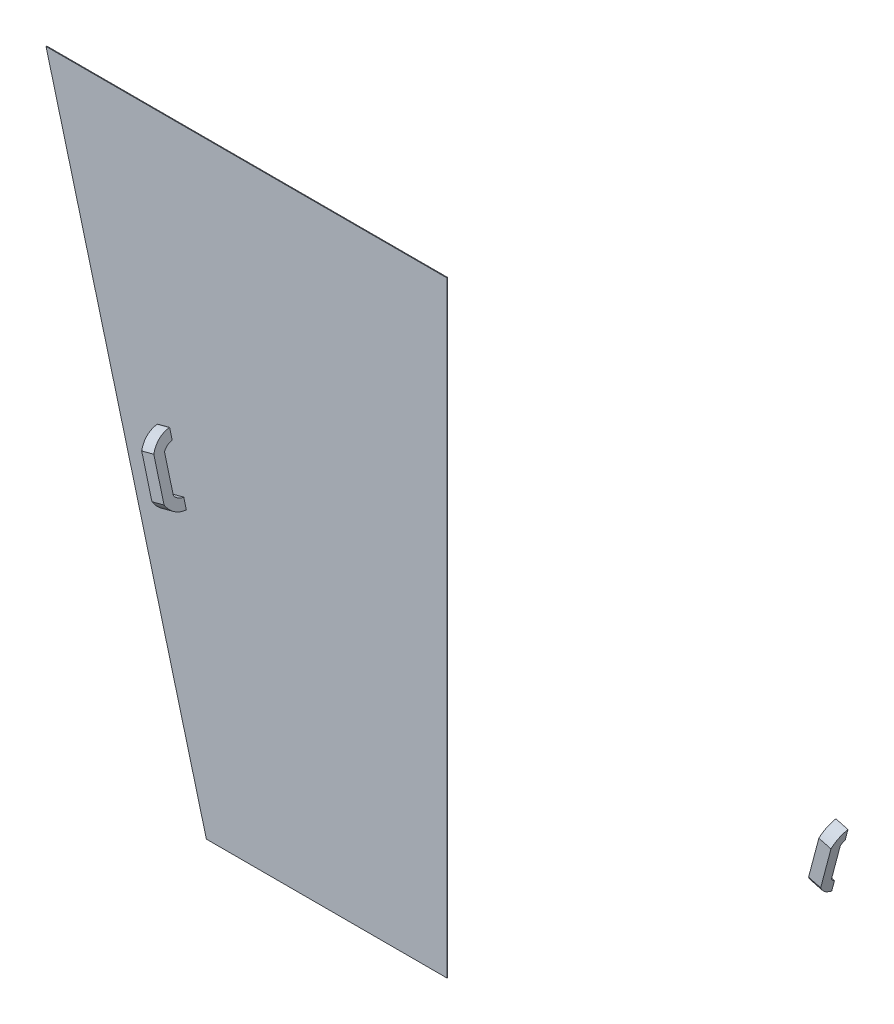
ISO-10303-21;
HEADER;
FILE_DESCRIPTION(('STEP AP214'),'2;1');
FILE_NAME('part.step','',(''),(''),'','','');
FILE_SCHEMA(('AUTOMOTIVE_DESIGN { 1 0 10303 214 1 1 1 1 }'));
ENDSEC;
DATA;
#1=APPLICATION_CONTEXT('core data for automotive mechanical design processes');
#2=APPLICATION_PROTOCOL_DEFINITION('international standard','automotive_design',2000,#1);
#3=PRODUCT_CONTEXT('',#1,'mechanical');
#4=PRODUCT('Part','Part','',(#3));
#5=PRODUCT_RELATED_PRODUCT_CATEGORY('part','',(#4));
#6=PRODUCT_DEFINITION_FORMATION('','',#4);
#7=PRODUCT_DEFINITION_CONTEXT('part definition',#1,'design');
#8=PRODUCT_DEFINITION('design','',#6,#7);
#9=PRODUCT_DEFINITION_SHAPE('','',#8);
#10=(LENGTH_UNIT() NAMED_UNIT(*) SI_UNIT(.MILLI.,.METRE.));
#11=(NAMED_UNIT(*) PLANE_ANGLE_UNIT() SI_UNIT($,.RADIAN.));
#12=(NAMED_UNIT(*) SI_UNIT($,.STERADIAN.) SOLID_ANGLE_UNIT());
#13=UNCERTAINTY_MEASURE_WITH_UNIT(LENGTH_MEASURE(1.E-05),#10,'distance_accuracy_value','');
#14=(GEOMETRIC_REPRESENTATION_CONTEXT(3) GLOBAL_UNCERTAINTY_ASSIGNED_CONTEXT((#13)) GLOBAL_UNIT_ASSIGNED_CONTEXT((#10,
#11,#12)) REPRESENTATION_CONTEXT('',''));
#15=CARTESIAN_POINT('',(0.,0.,0.));
#16=DIRECTION('',(0.,0.,1.));
#17=DIRECTION('',(1.,0.,0.));
#18=AXIS2_PLACEMENT_3D('',#15,#16,#17);
#19=CARTESIAN_POINT('',(679.510832108414,733.054769154828,965.148483057093));
#20=DIRECTION('',(0.,0.,-1.));
#21=DIRECTION('',(0.966763333893034,-0.255672947806422,0.));
#22=AXIS2_PLACEMENT_3D('',#19,#20,#21);
#23=PLANE('',#22);
#24=DIRECTION('',(0.255672947806422,0.966763333893034,0.));
#25=VECTOR('',#24,1.);
#26=CARTESIAN_POINT('',(653.364278305398,683.078697638291,965.148483057093));
#27=LINE('',#26,#25);
#28=CARTESIAN_POINT('',(664.056413461048,723.508333695592,965.148483057093));
#29=VERTEX_POINT('',#28);
#30=CARTESIAN_POINT('',(669.560993074781,744.322525360021,965.148483057093));
#31=VERTEX_POINT('',#30);
#32=EDGE_CURVE('P0_E168',#29,#31,#27,.T.);
#33=ORIENTED_EDGE('',*,*,#32,.T.);
#34=DIRECTION('',(0.966763333893034,-0.255672947806422,0.));
#35=VECTOR('',#34,1.);
#36=CARTESIAN_POINT('',(669.560993074781,744.322525360021,965.148483057093));
#37=LINE('',#36,#35);
#38=CARTESIAN_POINT('',(693.730076422107,737.93070166486,965.148483057093));
#39=VERTEX_POINT('',#38);
#40=EDGE_CURVE('P0_E54',#39,#31,#37,.F.);
#41=ORIENTED_EDGE('',*,*,#40,.F.);
#42=DIRECTION('',(0.255672947806422,0.966763333893034,0.));
#43=VECTOR('',#42,1.);
#44=CARTESIAN_POINT('',(677.533361652724,676.686873943131,965.148483057093));
#45=LINE('',#44,#43);
#46=CARTESIAN_POINT('',(688.225496808374,717.116510000432,965.148483057093));
#47=VERTEX_POINT('',#46);
#48=EDGE_CURVE('P0_E100',#47,#39,#45,.T.);
#49=ORIENTED_EDGE('',*,*,#48,.F.);
#50=DIRECTION('',(0.966763333893034,-0.255672947806422,0.));
#51=VECTOR('',#50,1.);
#52=CARTESIAN_POINT('',(664.056413461048,723.508333695592,965.148483057093));
#53=LINE('',#52,#51);
#54=EDGE_CURVE('P0_E102',#47,#29,#53,.F.);
#55=ORIENTED_EDGE('',*,*,#54,.T.);
#56=EDGE_LOOP('',(#33,#41,#49,#55));
#57=FACE_BOUND('',#56,.T.);
#58=ADVANCED_FACE('P0_F39',(#57),#23,.T.);
#59=CARTESIAN_POINT('',(648.264119836742,663.793723428685,952.767419476116));
#60=DIRECTION('',(0.966763333893034,-0.255672947806422,0.));
#61=DIRECTION('',(0.255672947806422,0.966763333893034,0.));
#62=AXIS2_PLACEMENT_3D('',#59,#60,#61);
#63=CYLINDRICAL_SURFACE('',#62,45.1328005466438);
#64=DIRECTION('',(0.966763333893034,-0.255672947806422,0.));
#65=VECTOR('',#64,1.);
#66=CARTESIAN_POINT('',(637.167563536015,621.834869916562,965.148483057093));
#67=LINE('',#66,#65);
#68=CARTESIAN_POINT('',(661.336646883341,615.443046221402,965.148483057093));
#69=VERTEX_POINT('',#68);
#70=CARTESIAN_POINT('',(637.167563536015,621.834869916562,965.148483057093));
#71=VERTEX_POINT('',#70);
#72=EDGE_CURVE('P0_E165',#69,#71,#67,.F.);
#73=ORIENTED_EDGE('',*,*,#72,.F.);
#74=CARTESIAN_POINT('',(672.433203184068,657.401899733524,952.767419476116));
#75=DIRECTION('',(-0.966763333893034,0.255672947806422,0.));
#76=DIRECTION('',(-0.255672947806422,-0.966763333893034,0.));
#77=AXIS2_PLACEMENT_3D('',#74,#75,#76);
#78=CIRCLE('',#77,45.1328005466438);
#79=CARTESIAN_POINT('',(667.279383255819,637.914018129833,993.148483057093));
#80=VERTEX_POINT('',#79);
#81=EDGE_CURVE('P0_E151',#80,#69,#78,.F.);
#82=ORIENTED_EDGE('',*,*,#81,.F.);
#83=DIRECTION('',(0.966763333893034,-0.255672947806422,0.));
#84=VECTOR('',#83,1.);
#85=CARTESIAN_POINT('',(643.110299908493,644.305841824994,993.148483057093));
#86=LINE('',#85,#84);
#87=CARTESIAN_POINT('',(643.110299908493,644.305841824994,993.148483057093));
#88=VERTEX_POINT('',#87);
#89=EDGE_CURVE('P0_E11',#88,#80,#86,.T.);
#90=ORIENTED_EDGE('',*,*,#89,.F.);
#91=CARTESIAN_POINT('',(648.264119836742,663.793723428685,952.767419476116));
#92=DIRECTION('',(-0.966763333893034,0.255672947806422,0.));
#93=DIRECTION('',(-0.255672947806422,-0.966763333893034,0.));
#94=AXIS2_PLACEMENT_3D('',#91,#92,#93);
#95=CIRCLE('',#94,45.1328005466438);
#96=EDGE_CURVE('P0_E133',#88,#71,#95,.F.);
#97=ORIENTED_EDGE('',*,*,#96,.T.);
#98=EDGE_LOOP('',(#73,#82,#90,#97));
#99=FACE_BOUND('',#98,.T.);
#100=ADVANCED_FACE('P0_F41',(#99),#63,.T.);
#101=CARTESIAN_POINT('',(653.364278305398,683.078697638291,993.148483057093));
#102=DIRECTION('',(0.,0.,1.));
#103=DIRECTION('',(-0.966763333893034,0.255672947806422,0.));
#104=AXIS2_PLACEMENT_3D('',#101,#102,#103);
#105=PLANE('',#104);
#106=DIRECTION('',(-0.255672947806422,-0.966763333893034,0.));
#107=VECTOR('',#106,1.);
#108=CARTESIAN_POINT('',(677.533361652724,676.686873943131,993.148483057093));
#109=LINE('',#108,#107);
#110=CARTESIAN_POINT('',(687.787340049629,715.459729756429,993.148483057093));
#111=VERTEX_POINT('',#110);
#112=EDGE_CURVE('P0_E127',#111,#80,#109,.T.);
#113=ORIENTED_EDGE('',*,*,#112,.F.);
#114=DIRECTION('',(0.966763333893034,-0.255672947806422,0.));
#115=VECTOR('',#114,1.);
#116=CARTESIAN_POINT('',(663.618256702303,721.851553451589,993.148483057093));
#117=LINE('',#116,#115);
#118=CARTESIAN_POINT('',(663.618256702303,721.851553451589,993.148483057093));
#119=VERTEX_POINT('',#118);
#120=EDGE_CURVE('P0_E47',#119,#111,#117,.T.);
#121=ORIENTED_EDGE('',*,*,#120,.F.);
#122=DIRECTION('',(-0.255672947806422,-0.966763333893034,0.));
#123=VECTOR('',#122,1.);
#124=CARTESIAN_POINT('',(653.364278305398,683.078697638291,993.148483057093));
#125=LINE('',#124,#123);
#126=EDGE_CURVE('P0_E161',#119,#88,#125,.T.);
#127=ORIENTED_EDGE('',*,*,#126,.T.);
#128=ORIENTED_EDGE('',*,*,#89,.T.);
#129=EDGE_LOOP('',(#113,#121,#127,#128));
#130=FACE_BOUND('',#129,.T.);
#131=ADVANCED_FACE('P0_F149',(#130),#105,.T.);
#132=CARTESIAN_POINT('',(658.464436774054,702.363671847898,952.767419476116));
#133=DIRECTION('',(0.966763333893034,-0.255672947806422,0.));
#134=DIRECTION('',(0.255672947806422,0.966763333893034,0.));
#135=AXIS2_PLACEMENT_3D('',#132,#133,#134);
#136=CYLINDRICAL_SURFACE('',#135,45.1328005466438);
#137=CARTESIAN_POINT('',(682.63352012138,695.971848152738,952.767419476116));
#138=DIRECTION('',(-0.966763333893034,0.255672947806422,0.));
#139=DIRECTION('',(-0.255672947806422,-0.966763333893034,0.));
#140=AXIS2_PLACEMENT_3D('',#137,#138,#139);
#141=CIRCLE('',#140,45.1328005466438);
#142=EDGE_CURVE('P0_E123',#111,#39,#141,.T.);
#143=ORIENTED_EDGE('',*,*,#142,.T.);
#144=ORIENTED_EDGE('',*,*,#40,.T.);
#145=CARTESIAN_POINT('',(658.464436774054,702.363671847898,952.767419476116));
#146=DIRECTION('',(-0.966763333893034,0.255672947806422,0.));
#147=DIRECTION('',(-0.255672947806422,-0.966763333893034,0.));
#148=AXIS2_PLACEMENT_3D('',#145,#146,#147);
#149=CIRCLE('',#148,45.1328005466438);
#150=EDGE_CURVE('P0_E143',#119,#31,#149,.T.);
#151=ORIENTED_EDGE('',*,*,#150,.F.);
#152=ORIENTED_EDGE('',*,*,#120,.T.);
#153=EDGE_LOOP('',(#143,#144,#151,#152));
#154=FACE_BOUND('',#153,.T.);
#155=ADVANCED_FACE('P0_F141',(#154),#136,.T.);
#156=CARTESIAN_POINT('',(658.464436774054,702.363671847898,952.767419476116));
#157=DIRECTION('',(0.966763333893034,-0.255672947806422,0.));
#158=DIRECTION('',(0.255672947806422,0.966763333893034,0.));
#159=AXIS2_PLACEMENT_3D('',#156,#157,#158);
#160=CYLINDRICAL_SURFACE('',#159,25.1328005466438);
#161=ORIENTED_EDGE('',*,*,#54,.F.);
#162=CARTESIAN_POINT('',(682.63352012138,695.971848152738,952.767419476116));
#163=DIRECTION('',(-0.966763333893034,0.255672947806422,0.));
#164=DIRECTION('',(-0.255672947806422,-0.966763333893034,0.));
#165=AXIS2_PLACEMENT_3D('',#162,#163,#164);
#166=CIRCLE('',#165,25.1328005466438);
#167=CARTESIAN_POINT('',(686.393476695963,710.189183950377,973.148483057093));
#168=VERTEX_POINT('',#167);
#169=EDGE_CURVE('P0_E114',#168,#47,#166,.T.);
#170=ORIENTED_EDGE('',*,*,#169,.F.);
#171=DIRECTION('',(0.966763333893034,-0.255672947806422,0.));
#172=VECTOR('',#171,1.);
#173=CARTESIAN_POINT('',(662.224393348637,716.581007645538,973.148483057093));
#174=LINE('',#173,#172);
#175=CARTESIAN_POINT('',(662.224393348637,716.581007645538,973.148483057093));
#176=VERTEX_POINT('',#175);
#177=EDGE_CURVE('P0_E137',#176,#168,#174,.T.);
#178=ORIENTED_EDGE('',*,*,#177,.F.);
#179=CARTESIAN_POINT('',(658.464436774054,702.363671847898,952.767419476116));
#180=DIRECTION('',(-0.966763333893034,0.255672947806422,0.));
#181=DIRECTION('',(-0.255672947806422,-0.966763333893034,0.));
#182=AXIS2_PLACEMENT_3D('',#179,#180,#181);
#183=CIRCLE('',#182,25.1328005466438);
#184=EDGE_CURVE('P0_E116',#176,#29,#183,.T.);
#185=ORIENTED_EDGE('',*,*,#184,.T.);
#186=EDGE_LOOP('',(#161,#170,#178,#185));
#187=FACE_BOUND('',#186,.T.);
#188=ADVANCED_FACE('P0_F113',(#187),#160,.F.);
#189=CARTESIAN_POINT('',(653.364278305398,683.078697638291,973.148483057093));
#190=DIRECTION('',(0.,0.,1.));
#191=DIRECTION('',(-0.966763333893034,0.255672947806422,0.));
#192=AXIS2_PLACEMENT_3D('',#189,#190,#191);
#193=PLANE('',#192);
#194=DIRECTION('',(-0.255672947806422,-0.966763333893034,0.));
#195=VECTOR('',#194,1.);
#196=CARTESIAN_POINT('',(677.533361652724,676.686873943131,973.148483057093));
#197=LINE('',#196,#195);
#198=CARTESIAN_POINT('',(668.673246609485,643.184563935885,973.148483057093));
#199=VERTEX_POINT('',#198);
#200=EDGE_CURVE('P0_E122',#168,#199,#197,.T.);
#201=ORIENTED_EDGE('',*,*,#200,.T.);
#202=DIRECTION('',(0.966763333893034,-0.255672947806422,0.));
#203=VECTOR('',#202,1.);
#204=CARTESIAN_POINT('',(644.504163262159,649.576387631045,973.148483057093));
#205=LINE('',#204,#203);
#206=CARTESIAN_POINT('',(644.504163262159,649.576387631045,973.148483057093));
#207=VERTEX_POINT('',#206);
#208=EDGE_CURVE('P0_E134',#207,#199,#205,.T.);
#209=ORIENTED_EDGE('',*,*,#208,.F.);
#210=DIRECTION('',(-0.255672947806422,-0.966763333893034,0.));
#211=VECTOR('',#210,1.);
#212=CARTESIAN_POINT('',(653.364278305398,683.078697638291,973.148483057093));
#213=LINE('',#212,#211);
#214=EDGE_CURVE('P0_E157',#176,#207,#213,.T.);
#215=ORIENTED_EDGE('',*,*,#214,.F.);
#216=ORIENTED_EDGE('',*,*,#177,.T.);
#217=EDGE_LOOP('',(#201,#209,#215,#216));
#218=FACE_BOUND('',#217,.T.);
#219=ADVANCED_FACE('P0_F182',(#218),#193,.F.);
#220=CARTESIAN_POINT('',(648.264119836742,663.793723428685,952.767419476116));
#221=DIRECTION('',(0.966763333893034,-0.255672947806422,0.));
#222=DIRECTION('',(0.255672947806422,0.966763333893034,0.));
#223=AXIS2_PLACEMENT_3D('',#220,#221,#222);
#224=CYLINDRICAL_SURFACE('',#223,25.1328005466438);
#225=CARTESIAN_POINT('',(672.433203184068,657.401899733524,952.767419476116));
#226=DIRECTION('',(-0.966763333893034,0.255672947806422,0.));
#227=DIRECTION('',(-0.255672947806422,-0.966763333893034,0.));
#228=AXIS2_PLACEMENT_3D('',#225,#226,#227);
#229=CIRCLE('',#228,25.1328005466438);
#230=CARTESIAN_POINT('',(666.841226497074,636.25723788583,965.148483057093));
#231=VERTEX_POINT('',#230);
#232=EDGE_CURVE('P0_E125',#199,#231,#229,.F.);
#233=ORIENTED_EDGE('',*,*,#232,.T.);
#234=DIRECTION('',(0.966763333893034,-0.255672947806422,0.));
#235=VECTOR('',#234,1.);
#236=CARTESIAN_POINT('',(642.672143149748,642.649061580991,965.148483057093));
#237=LINE('',#236,#235);
#238=CARTESIAN_POINT('',(642.672143149748,642.649061580991,965.148483057093));
#239=VERTEX_POINT('',#238);
#240=EDGE_CURVE('P0_E62',#231,#239,#237,.F.);
#241=ORIENTED_EDGE('',*,*,#240,.T.);
#242=CARTESIAN_POINT('',(648.264119836742,663.793723428685,952.767419476116));
#243=DIRECTION('',(-0.966763333893034,0.255672947806422,0.));
#244=DIRECTION('',(-0.255672947806422,-0.966763333893034,0.));
#245=AXIS2_PLACEMENT_3D('',#242,#243,#244);
#246=CIRCLE('',#245,25.1328005466438);
#247=EDGE_CURVE('P0_E138',#207,#239,#246,.F.);
#248=ORIENTED_EDGE('',*,*,#247,.F.);
#249=ORIENTED_EDGE('',*,*,#208,.T.);
#250=EDGE_LOOP('',(#233,#241,#248,#249));
#251=FACE_BOUND('',#250,.T.);
#252=ADVANCED_FACE('P0_F177',(#251),#224,.F.);
#253=CARTESIAN_POINT('',(653.364278305398,683.078697638291,955.148483057093));
#254=DIRECTION('',(-0.966763333893034,0.255672947806422,0.));
#255=DIRECTION('',(-0.255672947806422,-0.966763333893034,0.));
#256=AXIS2_PLACEMENT_3D('',#253,#254,#255);
#257=PLANE('',#256);
#258=EDGE_CURVE('P0_E152',#71,#239,#27,.T.);
#259=ORIENTED_EDGE('',*,*,#258,.F.);
#260=ORIENTED_EDGE('',*,*,#96,.F.);
#261=ORIENTED_EDGE('',*,*,#126,.F.);
#262=ORIENTED_EDGE('',*,*,#150,.T.);
#263=ORIENTED_EDGE('',*,*,#32,.F.);
#264=ORIENTED_EDGE('',*,*,#184,.F.);
#265=ORIENTED_EDGE('',*,*,#214,.T.);
#266=ORIENTED_EDGE('',*,*,#247,.T.);
#267=EDGE_LOOP('',(#259,#260,#261,#262,#263,#264,#265,#266));
#268=FACE_BOUND('',#267,.T.);
#269=ADVANCED_FACE('P0_F172',(#268),#257,.T.);
#270=CARTESIAN_POINT('',(677.533361652724,676.686873943131,955.148483057093));
#271=DIRECTION('',(-0.966763333893034,0.255672947806422,0.));
#272=DIRECTION('',(-0.255672947806422,-0.966763333893034,0.));
#273=AXIS2_PLACEMENT_3D('',#270,#271,#272);
#274=PLANE('',#273);
#275=ORIENTED_EDGE('',*,*,#81,.T.);
#276=EDGE_CURVE('P0_E109',#69,#231,#45,.T.);
#277=ORIENTED_EDGE('',*,*,#276,.T.);
#278=ORIENTED_EDGE('',*,*,#232,.F.);
#279=ORIENTED_EDGE('',*,*,#200,.F.);
#280=ORIENTED_EDGE('',*,*,#169,.T.);
#281=ORIENTED_EDGE('',*,*,#48,.T.);
#282=ORIENTED_EDGE('',*,*,#142,.F.);
#283=ORIENTED_EDGE('',*,*,#112,.T.);
#284=EDGE_LOOP('',(#275,#277,#278,#279,#280,#281,#282,#283));
#285=FACE_BOUND('',#284,.T.);
#286=ADVANCED_FACE('P0_F120',(#285),#274,.F.);
#287=CARTESIAN_POINT('',(651.386807849708,626.710802426594,965.148483057093));
#288=DIRECTION('',(0.,0.,1.));
#289=DIRECTION('',(-0.966763333893034,0.255672947806422,0.));
#290=AXIS2_PLACEMENT_3D('',#287,#288,#289);
#291=PLANE('',#290);
#292=ORIENTED_EDGE('',*,*,#258,.T.);
#293=ORIENTED_EDGE('',*,*,#240,.F.);
#294=ORIENTED_EDGE('',*,*,#276,.F.);
#295=ORIENTED_EDGE('',*,*,#72,.T.);
#296=EDGE_LOOP('',(#292,#293,#294,#295));
#297=FACE_BOUND('',#296,.T.);
#298=ADVANCED_FACE('P0_F197',(#297),#291,.F.);
#299=CLOSED_SHELL('',(#58,#100,#131,#155,#188,#219,#252,#269,#286,#298));
#300=MANIFOLD_SOLID_BREP('P0_B2_NOT_SHOWN',#299);
#301=CARTESIAN_POINT('',(-116.663606292097,71.088047630501,953.648483057093));
#302=DIRECTION('',(0.,1.,0.));
#303=DIRECTION('',(0.,0.,-1.));
#304=AXIS2_PLACEMENT_3D('',#301,#302,#303);
#305=PLANE('',#304);
#306=DIRECTION('',(-1.,0.,0.));
#307=VECTOR('',#306,1.);
#308=CARTESIAN_POINT('',(-116.663606292097,71.088047630501,955.148483057093));
#309=LINE('',#308,#307);
#310=CARTESIAN_POINT('',(-116.663606292097,71.088047630501,955.148483057093));
#311=VERTEX_POINT('',#310);
#312=CARTESIAN_POINT('',(-596.663606292097,71.088047630501,955.148483057093));
#313=VERTEX_POINT('',#312);
#314=EDGE_CURVE('P1_E85',#311,#313,#309,.T.);
#315=ORIENTED_EDGE('',*,*,#314,.T.);
#316=DIRECTION('',(0.,0.,1.));
#317=VECTOR('',#316,1.);
#318=CARTESIAN_POINT('',(-596.663606292097,71.088047630501,953.648483057093));
#319=LINE('',#318,#317);
#320=CARTESIAN_POINT('',(-596.663606292097,71.088047630501,953.648483057093));
#321=VERTEX_POINT('',#320);
#322=EDGE_CURVE('P1_E11',#321,#313,#319,.T.);
#323=ORIENTED_EDGE('',*,*,#322,.F.);
#324=DIRECTION('',(-1.,0.,0.));
#325=VECTOR('',#324,1.);
#326=CARTESIAN_POINT('',(-116.663606292097,71.088047630501,953.648483057093));
#327=LINE('',#326,#325);
#328=CARTESIAN_POINT('',(-116.663606292097,71.088047630501,953.648483057093));
#329=VERTEX_POINT('',#328);
#330=EDGE_CURVE('P1_E68',#329,#321,#327,.T.);
#331=ORIENTED_EDGE('',*,*,#330,.F.);
#332=DIRECTION('',(0.,0.,1.));
#333=VECTOR('',#332,1.);
#334=CARTESIAN_POINT('',(-116.663606292097,71.088047630501,953.648483057093));
#335=LINE('',#334,#333);
#336=EDGE_CURVE('P1_E81',#329,#311,#335,.T.);
#337=ORIENTED_EDGE('',*,*,#336,.T.);
#338=EDGE_LOOP('',(#315,#323,#331,#337));
#339=FACE_BOUND('',#338,.T.);
#340=ADVANCED_FACE('P1_F16',(#339),#305,.F.);
#341=CARTESIAN_POINT('',(-596.663606292097,71.088047630501,953.648483057093));
#342=DIRECTION('',(0.966763333893034,0.255672947806422,0.));
#343=DIRECTION('',(0.255672947806422,-0.966763333893034,0.));
#344=AXIS2_PLACEMENT_3D('',#341,#342,#343);
#345=PLANE('',#344);
#346=DIRECTION('',(-0.255672947806422,0.966763333893034,0.));
#347=VECTOR('',#346,1.);
#348=CARTESIAN_POINT('',(-596.663606292097,71.088047630501,955.148483057093));
#349=LINE('',#348,#347);
#350=CARTESIAN_POINT('',(-916.663606292097,1281.0880476305,955.148483057093));
#351=VERTEX_POINT('',#350);
#352=EDGE_CURVE('P1_E73',#313,#351,#349,.T.);
#353=ORIENTED_EDGE('',*,*,#352,.T.);
#354=DIRECTION('',(0.,0.,1.));
#355=VECTOR('',#354,1.);
#356=CARTESIAN_POINT('',(-916.663606292097,1281.0880476305,953.648483057093));
#357=LINE('',#356,#355);
#358=CARTESIAN_POINT('',(-916.663606292097,1281.0880476305,953.648483057093));
#359=VERTEX_POINT('',#358);
#360=EDGE_CURVE('P1_E25',#359,#351,#357,.T.);
#361=ORIENTED_EDGE('',*,*,#360,.F.);
#362=DIRECTION('',(-0.255672947806422,0.966763333893034,0.));
#363=VECTOR('',#362,1.);
#364=CARTESIAN_POINT('',(-596.663606292097,71.088047630501,953.648483057093));
#365=LINE('',#364,#363);
#366=EDGE_CURVE('P1_E63',#321,#359,#365,.T.);
#367=ORIENTED_EDGE('',*,*,#366,.F.);
#368=ORIENTED_EDGE('',*,*,#322,.T.);
#369=EDGE_LOOP('',(#353,#361,#367,#368));
#370=FACE_BOUND('',#369,.T.);
#371=ADVANCED_FACE('P1_F72',(#370),#345,.F.);
#372=CARTESIAN_POINT('',(-116.663606292097,1281.0880476305,953.648483057093));
#373=DIRECTION('',(0.,-1.,0.));
#374=DIRECTION('',(0.,0.,1.));
#375=AXIS2_PLACEMENT_3D('',#372,#373,#374);
#376=PLANE('',#375);
#377=DIRECTION('',(1.,0.,0.));
#378=VECTOR('',#377,1.);
#379=CARTESIAN_POINT('',(-116.663606292097,1281.0880476305,955.148483057093));
#380=LINE('',#379,#378);
#381=CARTESIAN_POINT('',(-116.663606292097,1281.0880476305,955.148483057093));
#382=VERTEX_POINT('',#381);
#383=EDGE_CURVE('P1_E50',#351,#382,#380,.T.);
#384=ORIENTED_EDGE('',*,*,#383,.T.);
#385=DIRECTION('',(0.,0.,1.));
#386=VECTOR('',#385,1.);
#387=CARTESIAN_POINT('',(-116.663606292097,1281.0880476305,953.648483057093));
#388=LINE('',#387,#386);
#389=CARTESIAN_POINT('',(-116.663606292097,1281.0880476305,953.648483057093));
#390=VERTEX_POINT('',#389);
#391=EDGE_CURVE('P1_E75',#390,#382,#388,.T.);
#392=ORIENTED_EDGE('',*,*,#391,.F.);
#393=DIRECTION('',(1.,0.,0.));
#394=VECTOR('',#393,1.);
#395=CARTESIAN_POINT('',(-116.663606292097,1281.0880476305,953.648483057093));
#396=LINE('',#395,#394);
#397=EDGE_CURVE('P1_E66',#359,#390,#396,.T.);
#398=ORIENTED_EDGE('',*,*,#397,.F.);
#399=ORIENTED_EDGE('',*,*,#360,.T.);
#400=EDGE_LOOP('',(#384,#392,#398,#399));
#401=FACE_BOUND('',#400,.T.);
#402=ADVANCED_FACE('P1_F76',(#401),#376,.F.);
#403=CARTESIAN_POINT('',(-116.663606292097,71.088047630501,953.648483057093));
#404=DIRECTION('',(-1.,0.,0.));
#405=DIRECTION('',(0.,0.,1.));
#406=AXIS2_PLACEMENT_3D('',#403,#404,#405);
#407=PLANE('',#406);
#408=DIRECTION('',(0.,-1.,0.));
#409=VECTOR('',#408,1.);
#410=CARTESIAN_POINT('',(-116.663606292097,71.088047630501,955.148483057093));
#411=LINE('',#410,#409);
#412=EDGE_CURVE('P1_E56',#382,#311,#411,.T.);
#413=ORIENTED_EDGE('',*,*,#412,.T.);
#414=ORIENTED_EDGE('',*,*,#336,.F.);
#415=DIRECTION('',(0.,-1.,0.));
#416=VECTOR('',#415,1.);
#417=CARTESIAN_POINT('',(-116.663606292097,71.088047630501,953.648483057093));
#418=LINE('',#417,#416);
#419=EDGE_CURVE('P1_E33',#390,#329,#418,.T.);
#420=ORIENTED_EDGE('',*,*,#419,.F.);
#421=ORIENTED_EDGE('',*,*,#391,.T.);
#422=EDGE_LOOP('',(#413,#414,#420,#421));
#423=FACE_BOUND('',#422,.T.);
#424=ADVANCED_FACE('P1_F98',(#423),#407,.F.);
#425=CARTESIAN_POINT('',(-358.62164825014,667.102033644487,953.648483057093));
#426=DIRECTION('',(0.,0.,-1.));
#427=DIRECTION('',(-1.,0.,0.));
#428=AXIS2_PLACEMENT_3D('',#425,#426,#427);
#429=PLANE('',#428);
#430=ORIENTED_EDGE('',*,*,#330,.T.);
#431=ORIENTED_EDGE('',*,*,#366,.T.);
#432=ORIENTED_EDGE('',*,*,#397,.T.);
#433=ORIENTED_EDGE('',*,*,#419,.T.);
#434=EDGE_LOOP('',(#430,#431,#432,#433));
#435=FACE_BOUND('',#434,.T.);
#436=ADVANCED_FACE('P1_F64',(#435),#429,.T.);
#437=CARTESIAN_POINT('',(-358.62164825014,667.102033644487,955.148483057093));
#438=DIRECTION('',(0.,0.,-1.));
#439=DIRECTION('',(-1.,0.,0.));
#440=AXIS2_PLACEMENT_3D('',#437,#438,#439);
#441=PLANE('',#440);
#442=ORIENTED_EDGE('',*,*,#314,.F.);
#443=ORIENTED_EDGE('',*,*,#412,.F.);
#444=ORIENTED_EDGE('',*,*,#383,.F.);
#445=ORIENTED_EDGE('',*,*,#352,.F.);
#446=EDGE_LOOP('',(#442,#443,#444,#445));
#447=FACE_BOUND('',#446,.T.);
#448=ADVANCED_FACE('P1_F101',(#447),#441,.F.);
#449=CLOSED_SHELL('',(#340,#371,#402,#424,#436,#448));
#450=MANIFOLD_SOLID_BREP('P1_B1',#449);
#451=CARTESIAN_POINT('',(-661.41832537938,615.751893034549,955.620940496729));
#452=DIRECTION('',(0.966763333893034,0.255672947806422,0.));
#453=DIRECTION('',(-0.255672947806422,0.966763333893034,0.));
#454=AXIS2_PLACEMENT_3D('',#451,#452,#453);
#455=CYLINDRICAL_SURFACE('',#454,1.95791401243348);
#456=CARTESIAN_POINT('',(-637.249242032054,622.143716729709,955.620940496729));
#457=DIRECTION('',(-0.966763333893034,-0.255672947806422,0.));
#458=DIRECTION('',(0.255672947806422,-0.966763333893034,0.));
#459=AXIS2_PLACEMENT_3D('',#456,#457,#458);
#460=CIRCLE('',#459,1.95791401243348);
#461=CARTESIAN_POINT('',(-636.751415255749,620.261309231807,955.826215416577));
#462=VERTEX_POINT('',#461);
#463=CARTESIAN_POINT('',(-636.763449218179,620.306812652245,955.148483057093));
#464=VERTEX_POINT('',#463);
#465=EDGE_CURVE('P2_E119',#462,#464,#460,.F.);
#466=ORIENTED_EDGE('',*,*,#465,.F.);
#467=DIRECTION('',(0.966763333893034,0.255672947806422,0.));
#468=VECTOR('',#467,1.);
#469=CARTESIAN_POINT('',(-660.920498603075,613.869485536646,955.826215416577));
#470=LINE('',#469,#468);
#471=CARTESIAN_POINT('',(-660.920498603075,613.869485536646,955.826215416577));
#472=VERTEX_POINT('',#471);
#473=EDGE_CURVE('P2_E11',#472,#462,#470,.T.);
#474=ORIENTED_EDGE('',*,*,#473,.F.);
#475=CARTESIAN_POINT('',(-661.41832537938,615.751893034549,955.620940496729));
#476=DIRECTION('',(-0.966763333893034,-0.255672947806422,0.));
#477=DIRECTION('',(0.255672947806422,-0.966763333893034,0.));
#478=AXIS2_PLACEMENT_3D('',#475,#476,#477);
#479=CIRCLE('',#478,1.95791401243348);
#480=CARTESIAN_POINT('',(-660.932532565505,613.914988957085,955.148483057093));
#481=VERTEX_POINT('',#480);
#482=EDGE_CURVE('P2_E143',#472,#481,#479,.F.);
#483=ORIENTED_EDGE('',*,*,#482,.T.);
#484=DIRECTION('',(0.966763333893034,0.255672947806422,0.));
#485=VECTOR('',#484,1.);
#486=CARTESIAN_POINT('',(-660.932532565505,613.914988957085,955.148483057093));
#487=LINE('',#486,#485);
#488=EDGE_CURVE('P2_E73',#481,#464,#487,.T.);
#489=ORIENTED_EDGE('',*,*,#488,.T.);
#490=EDGE_LOOP('',(#466,#474,#483,#489));
#491=FACE_BOUND('',#490,.T.);
#492=ADVANCED_FACE('P2_F16',(#491),#455,.T.);
#493=CARTESIAN_POINT('',(-672.433203184068,657.401899733524,952.767419476116));
#494=DIRECTION('',(0.966763333893034,0.255672947806422,0.));
#495=DIRECTION('',(-0.255672947806422,0.966763333893034,0.));
#496=AXIS2_PLACEMENT_3D('',#493,#494,#495);
#497=CYLINDRICAL_SURFACE('',#496,45.1328005466438);
#498=CARTESIAN_POINT('',(-648.264119836742,663.793723428685,952.767419476116));
#499=DIRECTION('',(-0.966763333893034,-0.255672947806422,0.));
#500=DIRECTION('',(0.255672947806422,-0.966763333893034,0.));
#501=AXIS2_PLACEMENT_3D('',#498,#499,#500);
#502=CIRCLE('',#501,45.1328005466438);
#503=CARTESIAN_POINT('',(-643.110299908493,644.305841824994,993.148483057093));
#504=VERTEX_POINT('',#503);
#505=EDGE_CURVE('P2_E122',#504,#462,#502,.F.);
#506=ORIENTED_EDGE('',*,*,#505,.F.);
#507=DIRECTION('',(0.966763333893034,0.255672947806422,0.));
#508=VECTOR('',#507,1.);
#509=CARTESIAN_POINT('',(-667.279383255819,637.914018129833,993.148483057093));
#510=LINE('',#509,#508);
#511=CARTESIAN_POINT('',(-667.279383255819,637.914018129833,993.148483057093));
#512=VERTEX_POINT('',#511);
#513=EDGE_CURVE('P2_E24',#512,#504,#510,.T.);
#514=ORIENTED_EDGE('',*,*,#513,.F.);
#515=CARTESIAN_POINT('',(-672.433203184068,657.401899733524,952.767419476116));
#516=DIRECTION('',(-0.966763333893034,-0.255672947806422,0.));
#517=DIRECTION('',(0.255672947806422,-0.966763333893034,0.));
#518=AXIS2_PLACEMENT_3D('',#515,#516,#517);
#519=CIRCLE('',#518,45.1328005466438);
#520=EDGE_CURVE('P2_E195',#512,#472,#519,.F.);
#521=ORIENTED_EDGE('',*,*,#520,.T.);
#522=ORIENTED_EDGE('',*,*,#473,.T.);
#523=EDGE_LOOP('',(#506,#514,#521,#522));
#524=FACE_BOUND('',#523,.T.);
#525=ADVANCED_FACE('P2_F166',(#524),#497,.T.);
#526=CARTESIAN_POINT('',(-677.533361652724,676.686873943131,993.148483057093));
#527=DIRECTION('',(0.,0.,1.));
#528=DIRECTION('',(-0.966763333893034,-0.255672947806422,0.));
#529=AXIS2_PLACEMENT_3D('',#526,#527,#528);
#530=PLANE('',#529);
#531=DIRECTION('',(0.255672947806422,-0.966763333893034,0.));
#532=VECTOR('',#531,1.);
#533=CARTESIAN_POINT('',(-653.364278305398,683.078697638291,993.148483057093));
#534=LINE('',#533,#532);
#535=CARTESIAN_POINT('',(-663.618256702303,721.851553451589,993.148483057093));
#536=VERTEX_POINT('',#535);
#537=EDGE_CURVE('P2_E126',#536,#504,#534,.T.);
#538=ORIENTED_EDGE('',*,*,#537,.F.);
#539=DIRECTION('',(0.966763333893034,0.255672947806422,0.));
#540=VECTOR('',#539,1.);
#541=CARTESIAN_POINT('',(-687.787340049629,715.459729756429,993.148483057093));
#542=LINE('',#541,#540);
#543=CARTESIAN_POINT('',(-687.787340049629,715.459729756429,993.148483057093));
#544=VERTEX_POINT('',#543);
#545=EDGE_CURVE('P2_E155',#544,#536,#542,.T.);
#546=ORIENTED_EDGE('',*,*,#545,.F.);
#547=DIRECTION('',(0.255672947806422,-0.966763333893034,0.));
#548=VECTOR('',#547,1.);
#549=CARTESIAN_POINT('',(-677.533361652724,676.686873943131,993.148483057093));
#550=LINE('',#549,#548);
#551=EDGE_CURVE('P2_E162',#544,#512,#550,.T.);
#552=ORIENTED_EDGE('',*,*,#551,.T.);
#553=ORIENTED_EDGE('',*,*,#513,.T.);
#554=EDGE_LOOP('',(#538,#546,#552,#553));
#555=FACE_BOUND('',#554,.T.);
#556=ADVANCED_FACE('P2_F160',(#555),#530,.T.);
#557=CARTESIAN_POINT('',(-682.63352012138,695.971848152738,952.767419476116));
#558=DIRECTION('',(0.966763333893034,0.255672947806422,0.));
#559=DIRECTION('',(-0.255672947806422,0.966763333893034,0.));
#560=AXIS2_PLACEMENT_3D('',#557,#558,#559);
#561=CYLINDRICAL_SURFACE('',#560,45.1328005466438);
#562=CARTESIAN_POINT('',(-658.464436774055,702.363671847898,952.767419476116));
#563=DIRECTION('',(-0.966763333893034,-0.255672947806422,0.));
#564=DIRECTION('',(0.255672947806422,-0.966763333893034,0.));
#565=AXIS2_PLACEMENT_3D('',#562,#563,#564);
#566=CIRCLE('',#565,45.1328005466438);
#567=CARTESIAN_POINT('',(-669.977141355047,745.896086044776,955.826215416577));
#568=VERTEX_POINT('',#567);
#569=EDGE_CURVE('P2_E129',#536,#568,#566,.T.);
#570=ORIENTED_EDGE('',*,*,#569,.T.);
#571=DIRECTION('',(0.966763333893034,0.255672947806422,0.));
#572=VECTOR('',#571,1.);
#573=CARTESIAN_POINT('',(-694.146224702373,739.504262349616,955.826215416577));
#574=LINE('',#573,#572);
#575=CARTESIAN_POINT('',(-694.146224702373,739.504262349616,955.826215416577));
#576=VERTEX_POINT('',#575);
#577=EDGE_CURVE('P2_E152',#576,#568,#574,.T.);
#578=ORIENTED_EDGE('',*,*,#577,.F.);
#579=CARTESIAN_POINT('',(-682.63352012138,695.971848152738,952.767419476116));
#580=DIRECTION('',(-0.966763333893034,-0.255672947806422,0.));
#581=DIRECTION('',(0.255672947806422,-0.966763333893034,0.));
#582=AXIS2_PLACEMENT_3D('',#579,#580,#581);
#583=CIRCLE('',#582,45.1328005466438);
#584=EDGE_CURVE('P2_E183',#544,#576,#583,.T.);
#585=ORIENTED_EDGE('',*,*,#584,.F.);
#586=ORIENTED_EDGE('',*,*,#545,.T.);
#587=EDGE_LOOP('',(#570,#578,#585,#586));
#588=FACE_BOUND('',#587,.T.);
#589=ADVANCED_FACE('P2_F174',(#588),#561,.T.);
#590=CARTESIAN_POINT('',(-690.238811117675,724.729354732475,953.528586121945));
#591=DIRECTION('',(0.966763333893034,0.255672947806422,0.));
#592=DIRECTION('',(-0.255672947806422,0.966763333893034,0.));
#593=AXIS2_PLACEMENT_3D('',#590,#591,#592);
#594=CYLINDRICAL_SURFACE('',#593,15.4546069633774);
#595=CARTESIAN_POINT('',(-666.069727770349,731.121178427636,953.528586121945));
#596=DIRECTION('',(-0.966763333893034,-0.255672947806422,0.));
#597=DIRECTION('',(0.255672947806422,-0.966763333893034,0.));
#598=AXIS2_PLACEMENT_3D('',#595,#596,#597);
#599=CIRCLE('',#598,15.4546069633774);
#600=CARTESIAN_POINT('',(-669.99928715354,745.979824845326,955.148483057093));
#601=VERTEX_POINT('',#600);
#602=EDGE_CURVE('P2_E131',#568,#601,#599,.T.);
#603=ORIENTED_EDGE('',*,*,#602,.T.);
#604=DIRECTION('',(0.966763333893034,0.255672947806422,0.));
#605=VECTOR('',#604,1.);
#606=CARTESIAN_POINT('',(-694.168370500866,739.588001150166,955.148483057093));
#607=LINE('',#606,#605);
#608=CARTESIAN_POINT('',(-694.168370500866,739.588001150166,955.148483057093));
#609=VERTEX_POINT('',#608);
#610=EDGE_CURVE('P2_E149',#609,#601,#607,.T.);
#611=ORIENTED_EDGE('',*,*,#610,.F.);
#612=CARTESIAN_POINT('',(-690.238811117675,724.729354732475,953.528586121945));
#613=DIRECTION('',(-0.966763333893034,-0.255672947806422,0.));
#614=DIRECTION('',(0.255672947806422,-0.966763333893034,0.));
#615=AXIS2_PLACEMENT_3D('',#612,#613,#614);
#616=CIRCLE('',#615,15.4546069633774);
#617=EDGE_CURVE('P2_E180',#576,#609,#616,.T.);
#618=ORIENTED_EDGE('',*,*,#617,.F.);
#619=ORIENTED_EDGE('',*,*,#577,.T.);
#620=EDGE_LOOP('',(#603,#611,#618,#619));
#621=FACE_BOUND('',#620,.T.);
#622=ADVANCED_FACE('P2_F178',(#621),#594,.T.);
#623=CARTESIAN_POINT('',(-677.533361652724,676.686873943131,955.148483057093));
#624=DIRECTION('',(0.,0.,1.));
#625=DIRECTION('',(-0.966763333893034,-0.255672947806422,0.));
#626=AXIS2_PLACEMENT_3D('',#623,#624,#625);
#627=PLANE('',#626);
#628=CARTESIAN_POINT('',(-679.510832108414,733.054769154828,955.148483057093));
#629=DIRECTION('',(0.,0.,-1.));
#630=DIRECTION('',(0.966763333893034,0.255672947806422,0.));
#631=AXIS2_PLACEMENT_3D('',#628,#629,#630);
#632=CIRCLE('',#631,2.);
#633=CARTESIAN_POINT('',(-677.577305440628,733.566115050441,955.148483057093));
#634=VERTEX_POINT('',#633);
#635=EDGE_CURVE('P2_E205',#634,#634,#632,.T.);
#636=ORIENTED_EDGE('',*,*,#635,.F.);
#637=EDGE_LOOP('',(#636));
#638=FACE_BOUND('',#637,.T.);
#639=DIRECTION('',(0.255672947806422,-0.966763333893034,0.));
#640=VECTOR('',#639,1.);
#641=CARTESIAN_POINT('',(-653.364278305398,683.078697638291,955.148483057093));
#642=LINE('',#641,#640);
#643=CARTESIAN_POINT('',(-664.861311591189,726.551854750188,955.148483057093));
#644=VERTEX_POINT('',#643);
#645=EDGE_CURVE('P2_E133',#601,#644,#642,.T.);
#646=ORIENTED_EDGE('',*,*,#645,.T.);
#647=DIRECTION('',(0.966763333893034,0.255672947806422,0.));
#648=VECTOR('',#647,1.);
#649=CARTESIAN_POINT('',(-689.030394938515,720.160031055028,955.148483057093));
#650=LINE('',#649,#648);
#651=CARTESIAN_POINT('',(-689.030394938515,720.160031055028,955.148483057093));
#652=VERTEX_POINT('',#651);
#653=EDGE_CURVE('P2_E147',#652,#644,#650,.T.);
#654=ORIENTED_EDGE('',*,*,#653,.F.);
#655=DIRECTION('',(0.255672947806422,-0.966763333893034,0.));
#656=VECTOR('',#655,1.);
#657=CARTESIAN_POINT('',(-677.533361652724,676.686873943131,955.148483057093));
#658=LINE('',#657,#656);
#659=EDGE_CURVE('P2_E182',#609,#652,#658,.T.);
#660=ORIENTED_EDGE('',*,*,#659,.F.);
#661=ORIENTED_EDGE('',*,*,#610,.T.);
#662=EDGE_LOOP('',(#646,#654,#660,#661));
#663=FACE_BOUND('',#662,.T.);
#664=ADVANCED_FACE('P2_F220',(#638,#663),#627,.F.);
#665=CARTESIAN_POINT('',(-682.63352012138,695.971848152738,952.767419476116));
#666=DIRECTION('',(0.966763333893034,0.255672947806422,0.));
#667=DIRECTION('',(-0.255672947806422,0.966763333893034,0.));
#668=AXIS2_PLACEMENT_3D('',#665,#666,#667);
#669=CYLINDRICAL_SURFACE('',#668,25.1328005466438);
#670=CARTESIAN_POINT('',(-658.464436774055,702.363671847898,952.767419476116));
#671=DIRECTION('',(-0.966763333893034,-0.255672947806422,0.));
#672=DIRECTION('',(0.255672947806422,-0.966763333893034,0.));
#673=AXIS2_PLACEMENT_3D('',#670,#671,#672);
#674=CIRCLE('',#673,25.1328005466438);
#675=CARTESIAN_POINT('',(-662.224393348637,716.581007645538,973.148483057093));
#676=VERTEX_POINT('',#675);
#677=EDGE_CURVE('P2_E136',#676,#644,#674,.T.);
#678=ORIENTED_EDGE('',*,*,#677,.F.);
#679=DIRECTION('',(0.966763333893034,0.255672947806422,0.));
#680=VECTOR('',#679,1.);
#681=CARTESIAN_POINT('',(-686.393476695963,710.189183950377,973.148483057093));
#682=LINE('',#681,#680);
#683=CARTESIAN_POINT('',(-686.393476695963,710.189183950377,973.148483057093));
#684=VERTEX_POINT('',#683);
#685=EDGE_CURVE('P2_E111',#684,#676,#682,.T.);
#686=ORIENTED_EDGE('',*,*,#685,.F.);
#687=CARTESIAN_POINT('',(-682.63352012138,695.971848152738,952.767419476116));
#688=DIRECTION('',(-0.966763333893034,-0.255672947806422,0.));
#689=DIRECTION('',(0.255672947806422,-0.966763333893034,0.));
#690=AXIS2_PLACEMENT_3D('',#687,#688,#689);
#691=CIRCLE('',#690,25.1328005466438);
#692=EDGE_CURVE('P2_E104',#684,#652,#691,.T.);
#693=ORIENTED_EDGE('',*,*,#692,.T.);
#694=ORIENTED_EDGE('',*,*,#653,.T.);
#695=EDGE_LOOP('',(#678,#686,#693,#694));
#696=FACE_BOUND('',#695,.T.);
#697=ADVANCED_FACE('P2_F190',(#696),#669,.F.);
#698=CARTESIAN_POINT('',(-677.533361652724,676.686873943131,973.148483057093));
#699=DIRECTION('',(0.,0.,1.));
#700=DIRECTION('',(-0.966763333893034,-0.255672947806422,0.));
#701=AXIS2_PLACEMENT_3D('',#698,#699,#700);
#702=PLANE('',#701);
#703=DIRECTION('',(0.255672947806422,-0.966763333893034,0.));
#704=VECTOR('',#703,1.);
#705=CARTESIAN_POINT('',(-653.364278305398,683.078697638291,973.148483057093));
#706=LINE('',#705,#704);
#707=CARTESIAN_POINT('',(-644.50416326216,649.576387631045,973.148483057093));
#708=VERTEX_POINT('',#707);
#709=EDGE_CURVE('P2_E110',#676,#708,#706,.T.);
#710=ORIENTED_EDGE('',*,*,#709,.T.);
#711=DIRECTION('',(0.966763333893034,0.255672947806422,0.));
#712=VECTOR('',#711,1.);
#713=CARTESIAN_POINT('',(-668.673246609485,643.184563935885,973.148483057093));
#714=LINE('',#713,#712);
#715=CARTESIAN_POINT('',(-668.673246609485,643.184563935885,973.148483057093));
#716=VERTEX_POINT('',#715);
#717=EDGE_CURVE('P2_E107',#716,#708,#714,.T.);
#718=ORIENTED_EDGE('',*,*,#717,.F.);
#719=DIRECTION('',(0.255672947806422,-0.966763333893034,0.));
#720=VECTOR('',#719,1.);
#721=CARTESIAN_POINT('',(-677.533361652724,676.686873943131,973.148483057093));
#722=LINE('',#721,#720);
#723=EDGE_CURVE('P2_E98',#684,#716,#722,.T.);
#724=ORIENTED_EDGE('',*,*,#723,.F.);
#725=ORIENTED_EDGE('',*,*,#685,.T.);
#726=EDGE_LOOP('',(#710,#718,#724,#725));
#727=FACE_BOUND('',#726,.T.);
#728=ADVANCED_FACE('P2_F108',(#727),#702,.F.);
#729=CARTESIAN_POINT('',(-672.433203184068,657.401899733524,952.767419476116));
#730=DIRECTION('',(0.966763333893034,0.255672947806422,0.));
#731=DIRECTION('',(-0.255672947806422,0.966763333893034,0.));
#732=AXIS2_PLACEMENT_3D('',#729,#730,#731);
#733=CYLINDRICAL_SURFACE('',#732,25.1328005466438);
#734=CARTESIAN_POINT('',(-648.264119836742,663.793723428685,952.767419476116));
#735=DIRECTION('',(-0.966763333893034,-0.255672947806422,0.));
#736=DIRECTION('',(0.255672947806422,-0.966763333893034,0.));
#737=AXIS2_PLACEMENT_3D('',#734,#735,#736);
#738=CIRCLE('',#737,25.1328005466438);
#739=CARTESIAN_POINT('',(-641.867245019607,639.605540526395,955.148483057093));
#740=VERTEX_POINT('',#739);
#741=EDGE_CURVE('P2_E66',#708,#740,#738,.F.);
#742=ORIENTED_EDGE('',*,*,#741,.T.);
#743=DIRECTION('',(0.966763333893034,0.255672947806422,0.));
#744=VECTOR('',#743,1.);
#745=CARTESIAN_POINT('',(-666.036328366933,633.213716831234,955.148483057093));
#746=LINE('',#745,#744);
#747=CARTESIAN_POINT('',(-666.036328366933,633.213716831234,955.148483057093));
#748=VERTEX_POINT('',#747);
#749=EDGE_CURVE('P2_E112',#748,#740,#746,.T.);
#750=ORIENTED_EDGE('',*,*,#749,.F.);
#751=CARTESIAN_POINT('',(-672.433203184068,657.401899733524,952.767419476116));
#752=DIRECTION('',(-0.966763333893034,-0.255672947806422,0.));
#753=DIRECTION('',(0.255672947806422,-0.966763333893034,0.));
#754=AXIS2_PLACEMENT_3D('',#751,#752,#753);
#755=CIRCLE('',#754,25.1328005466438);
#756=EDGE_CURVE('P2_E102',#716,#748,#755,.F.);
#757=ORIENTED_EDGE('',*,*,#756,.F.);
#758=ORIENTED_EDGE('',*,*,#717,.T.);
#759=EDGE_LOOP('',(#742,#750,#757,#758));
#760=FACE_BOUND('',#759,.T.);
#761=ADVANCED_FACE('P2_F114',(#760),#733,.F.);
#762=CARTESIAN_POINT('',(-677.533361652724,676.686873943131,955.148483057093));
#763=DIRECTION('',(0.,0.,1.));
#764=DIRECTION('',(-0.966763333893034,-0.255672947806422,0.));
#765=AXIS2_PLACEMENT_3D('',#762,#763,#764);
#766=PLANE('',#765);
#767=CARTESIAN_POINT('',(-651.386807849708,626.710802426594,955.148483057093));
#768=DIRECTION('',(0.,0.,-1.));
#769=DIRECTION('',(-0.966763333893034,-0.255672947806422,0.));
#770=AXIS2_PLACEMENT_3D('',#767,#768,#769);
#771=CIRCLE('',#770,2.);
#772=CARTESIAN_POINT('',(-653.320334517494,626.199456530981,955.148483057093));
#773=VERTEX_POINT('',#772);
#774=EDGE_CURVE('P2_E199',#773,#773,#771,.T.);
#775=ORIENTED_EDGE('',*,*,#774,.F.);
#776=EDGE_LOOP('',(#775));
#777=FACE_BOUND('',#776,.T.);
#778=DIRECTION('',(0.255672947806422,-0.966763333893034,0.));
#779=VECTOR('',#778,1.);
#780=CARTESIAN_POINT('',(-653.364278305398,683.078697638291,955.148483057093));
#781=LINE('',#780,#779);
#782=EDGE_CURVE('P2_E141',#740,#464,#781,.T.);
#783=ORIENTED_EDGE('',*,*,#782,.T.);
#784=ORIENTED_EDGE('',*,*,#488,.F.);
#785=DIRECTION('',(0.255672947806422,-0.966763333893034,0.));
#786=VECTOR('',#785,1.);
#787=CARTESIAN_POINT('',(-677.533361652724,676.686873943131,955.148483057093));
#788=LINE('',#787,#786);
#789=EDGE_CURVE('P2_E32',#748,#481,#788,.T.);
#790=ORIENTED_EDGE('',*,*,#789,.F.);
#791=ORIENTED_EDGE('',*,*,#749,.T.);
#792=EDGE_LOOP('',(#783,#784,#790,#791));
#793=FACE_BOUND('',#792,.T.);
#794=ADVANCED_FACE('P2_F194',(#777,#793),#766,.F.);
#795=CARTESIAN_POINT('',(-677.533361652724,676.686873943131,955.148483057093));
#796=DIRECTION('',(-0.966763333893034,-0.255672947806422,0.));
#797=DIRECTION('',(0.255672947806422,-0.966763333893034,0.));
#798=AXIS2_PLACEMENT_3D('',#795,#796,#797);
#799=PLANE('',#798);
#800=ORIENTED_EDGE('',*,*,#482,.F.);
#801=ORIENTED_EDGE('',*,*,#520,.F.);
#802=ORIENTED_EDGE('',*,*,#551,.F.);
#803=ORIENTED_EDGE('',*,*,#584,.T.);
#804=ORIENTED_EDGE('',*,*,#617,.T.);
#805=ORIENTED_EDGE('',*,*,#659,.T.);
#806=ORIENTED_EDGE('',*,*,#692,.F.);
#807=ORIENTED_EDGE('',*,*,#723,.T.);
#808=ORIENTED_EDGE('',*,*,#756,.T.);
#809=ORIENTED_EDGE('',*,*,#789,.T.);
#810=EDGE_LOOP('',(#800,#801,#802,#803,#804,#805,#806,#807,#808,#809));
#811=FACE_BOUND('',#810,.T.);
#812=ADVANCED_FACE('P2_F100',(#811),#799,.T.);
#813=CARTESIAN_POINT('',(-653.364278305398,683.078697638291,955.148483057093));
#814=DIRECTION('',(-0.966763333893034,-0.255672947806422,0.));
#815=DIRECTION('',(0.255672947806422,-0.966763333893034,0.));
#816=AXIS2_PLACEMENT_3D('',#813,#814,#815);
#817=PLANE('',#816);
#818=ORIENTED_EDGE('',*,*,#465,.T.);
#819=ORIENTED_EDGE('',*,*,#782,.F.);
#820=ORIENTED_EDGE('',*,*,#741,.F.);
#821=ORIENTED_EDGE('',*,*,#709,.F.);
#822=ORIENTED_EDGE('',*,*,#677,.T.);
#823=ORIENTED_EDGE('',*,*,#645,.F.);
#824=ORIENTED_EDGE('',*,*,#602,.F.);
#825=ORIENTED_EDGE('',*,*,#569,.F.);
#826=ORIENTED_EDGE('',*,*,#537,.T.);
#827=ORIENTED_EDGE('',*,*,#505,.T.);
#828=EDGE_LOOP('',(#818,#819,#820,#821,#822,#823,#824,#825,#826,#827));
#829=FACE_BOUND('',#828,.T.);
#830=ADVANCED_FACE('P2_F169',(#829),#817,.F.);
#831=CARTESIAN_POINT('',(-651.386807849708,626.710802426594,965.148483057093));
#832=DIRECTION('',(0.,0.,-1.));
#833=DIRECTION('',(0.966763333893034,0.255672947806422,0.));
#834=AXIS2_PLACEMENT_3D('',#831,#832,#833);
#835=CYLINDRICAL_SURFACE('',#834,2.);
#836=CARTESIAN_POINT('',(-651.386807849708,626.710802426594,965.148483057093));
#837=DIRECTION('',(0.,0.,-1.));
#838=DIRECTION('',(-0.966763333893034,-0.255672947806422,0.));
#839=AXIS2_PLACEMENT_3D('',#836,#837,#838);
#840=CIRCLE('',#839,2.);
#841=CARTESIAN_POINT('',(-653.320334517494,626.199456530981,965.148483057093));
#842=VERTEX_POINT('',#841);
#843=EDGE_CURVE('P2_E202',#842,#842,#840,.T.);
#844=ORIENTED_EDGE('',*,*,#843,.F.);
#845=EDGE_LOOP('',(#844));
#846=FACE_BOUND('',#845,.T.);
#847=ORIENTED_EDGE('',*,*,#774,.T.);
#848=EDGE_LOOP('',(#847));
#849=FACE_BOUND('',#848,.T.);
#850=ADVANCED_FACE('P2_F306',(#846,#849),#835,.F.);
#851=CARTESIAN_POINT('',(-651.386807849708,626.710802426594,965.148483057093));
#852=DIRECTION('',(0.,0.,1.));
#853=DIRECTION('',(-0.966763333893034,-0.255672947806422,0.));
#854=AXIS2_PLACEMENT_3D('',#851,#852,#853);
#855=PLANE('',#854);
#856=ORIENTED_EDGE('',*,*,#843,.T.);
#857=EDGE_LOOP('',(#856));
#858=FACE_BOUND('',#857,.T.);
#859=ADVANCED_FACE('P2_F216',(#858),#855,.F.);
#860=CARTESIAN_POINT('',(-679.510832108414,733.054769154828,965.148483057093));
#861=DIRECTION('',(0.,0.,-1.));
#862=DIRECTION('',(0.966763333893034,0.255672947806422,0.));
#863=AXIS2_PLACEMENT_3D('',#860,#861,#862);
#864=CYLINDRICAL_SURFACE('',#863,2.);
#865=CARTESIAN_POINT('',(-679.510832108414,733.054769154828,965.148483057093));
#866=DIRECTION('',(0.,0.,-1.));
#867=DIRECTION('',(0.966763333893034,0.255672947806422,0.));
#868=AXIS2_PLACEMENT_3D('',#865,#866,#867);
#869=CIRCLE('',#868,2.);
#870=CARTESIAN_POINT('',(-677.577305440628,733.566115050441,965.148483057093));
#871=VERTEX_POINT('',#870);
#872=EDGE_CURVE('P2_E123',#871,#871,#869,.T.);
#873=ORIENTED_EDGE('',*,*,#872,.F.);
#874=EDGE_LOOP('',(#873));
#875=FACE_BOUND('',#874,.T.);
#876=ORIENTED_EDGE('',*,*,#635,.T.);
#877=EDGE_LOOP('',(#876));
#878=FACE_BOUND('',#877,.T.);
#879=ADVANCED_FACE('P2_F213',(#875,#878),#864,.F.);
#880=CARTESIAN_POINT('',(-679.510832108414,733.054769154828,965.148483057093));
#881=DIRECTION('',(0.,0.,-1.));
#882=DIRECTION('',(0.966763333893034,0.255672947806422,0.));
#883=AXIS2_PLACEMENT_3D('',#880,#881,#882);
#884=PLANE('',#883);
#885=ORIENTED_EDGE('',*,*,#872,.T.);
#886=EDGE_LOOP('',(#885));
#887=FACE_BOUND('',#886,.T.);
#888=ADVANCED_FACE('P2_F211',(#887),#884,.T.);
#889=CLOSED_SHELL('',(#492,#525,#556,#589,#622,#664,#697,#728,#761,#794,#812,#830,#850,#859,
#879,#888));
#890=MANIFOLD_SOLID_BREP('P2_B1',#889);
#891=ADVANCED_BREP_SHAPE_REPRESENTATION('',(#18,#300,#450,#890),#14);
#892=SHAPE_DEFINITION_REPRESENTATION(#9,#891);
ENDSEC;
END-ISO-10303-21;
